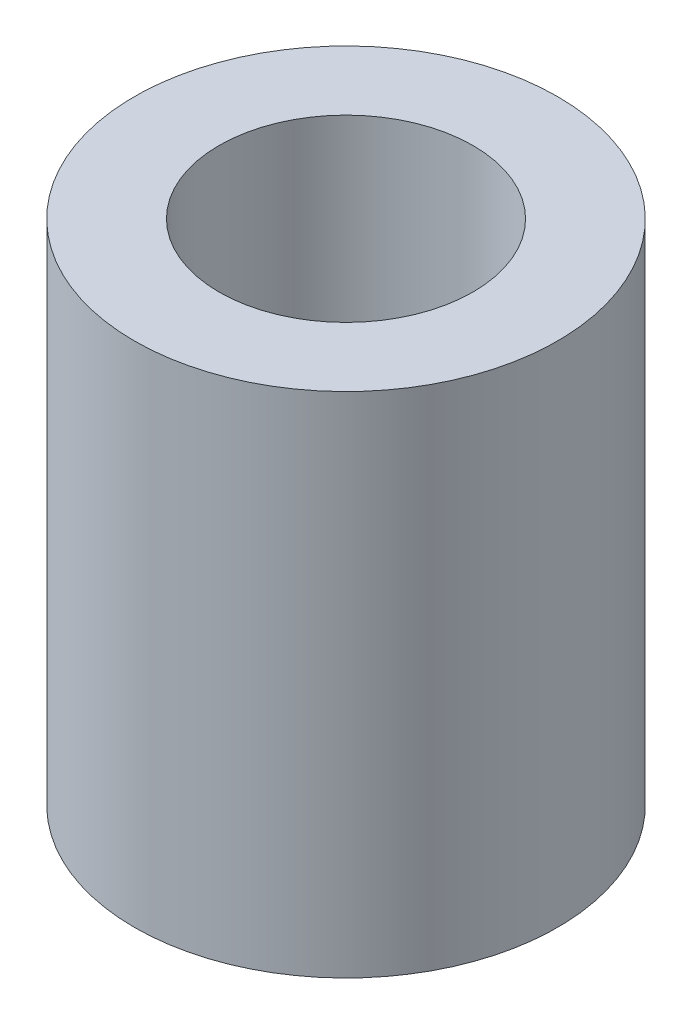
ISO-10303-21;
HEADER;
FILE_DESCRIPTION(('STEP AP214'),'2;1');
FILE_NAME('part.step','',(''),(''),'','','');
FILE_SCHEMA(('AUTOMOTIVE_DESIGN { 1 0 10303 214 1 1 1 1 }'));
ENDSEC;
DATA;
#1=APPLICATION_CONTEXT('core data for automotive mechanical design processes');
#2=APPLICATION_PROTOCOL_DEFINITION('international standard','automotive_design',2000,#1);
#3=PRODUCT_CONTEXT('',#1,'mechanical');
#4=PRODUCT('Part','Part','',(#3));
#5=PRODUCT_RELATED_PRODUCT_CATEGORY('part','',(#4));
#6=PRODUCT_DEFINITION_FORMATION('','',#4);
#7=PRODUCT_DEFINITION_CONTEXT('part definition',#1,'design');
#8=PRODUCT_DEFINITION('design','',#6,#7);
#9=PRODUCT_DEFINITION_SHAPE('','',#8);
#10=(LENGTH_UNIT() NAMED_UNIT(*) SI_UNIT(.MILLI.,.METRE.));
#11=(NAMED_UNIT(*) PLANE_ANGLE_UNIT() SI_UNIT($,.RADIAN.));
#12=(NAMED_UNIT(*) SI_UNIT($,.STERADIAN.) SOLID_ANGLE_UNIT());
#13=UNCERTAINTY_MEASURE_WITH_UNIT(LENGTH_MEASURE(1.E-05),#10,'distance_accuracy_value','');
#14=(GEOMETRIC_REPRESENTATION_CONTEXT(3) GLOBAL_UNCERTAINTY_ASSIGNED_CONTEXT((#13)) GLOBAL_UNIT_ASSIGNED_CONTEXT((#10,
#11,#12)) REPRESENTATION_CONTEXT('',''));
#15=CARTESIAN_POINT('',(0.,0.,0.));
#16=DIRECTION('',(0.,0.,1.));
#17=DIRECTION('',(1.,0.,0.));
#18=AXIS2_PLACEMENT_3D('',#15,#16,#17);
#19=CARTESIAN_POINT('',(0.,38.1,0.));
#20=DIRECTION('',(0.,1.,0.));
#21=DIRECTION('',(0.,0.,1.));
#22=AXIS2_PLACEMENT_3D('',#19,#20,#21);
#23=PLANE('',#22);
#24=CARTESIAN_POINT('',(0.,38.1,0.));
#25=DIRECTION('',(0.,1.,0.));
#26=DIRECTION('',(0.,0.,1.));
#27=AXIS2_PLACEMENT_3D('',#24,#25,#26);
#28=CIRCLE('',#27,15.875);
#29=CARTESIAN_POINT('',(0.,38.1,15.875));
#30=VERTEX_POINT('',#29);
#31=EDGE_CURVE('E10',#30,#30,#28,.T.);
#32=ORIENTED_EDGE('',*,*,#31,.T.);
#33=EDGE_LOOP('',(#32));
#34=FACE_BOUND('',#33,.T.);
#35=CARTESIAN_POINT('',(0.,38.1,0.));
#36=DIRECTION('',(0.,1.,0.));
#37=DIRECTION('',(0.,0.,1.));
#38=AXIS2_PLACEMENT_3D('',#35,#36,#37);
#39=CIRCLE('',#38,9.525);
#40=CARTESIAN_POINT('',(0.,38.1,9.525));
#41=VERTEX_POINT('',#40);
#42=EDGE_CURVE('E44',#41,#41,#39,.T.);
#43=ORIENTED_EDGE('',*,*,#42,.F.);
#44=EDGE_LOOP('',(#43));
#45=FACE_BOUND('',#44,.T.);
#46=ADVANCED_FACE('F33',(#34,#45),#23,.T.);
#47=CARTESIAN_POINT('',(0.,0.,0.));
#48=DIRECTION('',(0.,1.,0.));
#49=DIRECTION('',(0.,0.,1.));
#50=AXIS2_PLACEMENT_3D('',#47,#48,#49);
#51=PLANE('',#50);
#52=CARTESIAN_POINT('',(0.,0.,0.));
#53=DIRECTION('',(0.,1.,0.));
#54=DIRECTION('',(0.,0.,1.));
#55=AXIS2_PLACEMENT_3D('',#52,#53,#54);
#56=CIRCLE('',#55,15.875);
#57=CARTESIAN_POINT('',(0.,0.,15.875));
#58=VERTEX_POINT('',#57);
#59=EDGE_CURVE('E37',#58,#58,#56,.T.);
#60=ORIENTED_EDGE('',*,*,#59,.F.);
#61=EDGE_LOOP('',(#60));
#62=FACE_BOUND('',#61,.T.);
#63=CARTESIAN_POINT('',(0.,0.,0.));
#64=DIRECTION('',(0.,1.,0.));
#65=DIRECTION('',(0.,0.,1.));
#66=AXIS2_PLACEMENT_3D('',#63,#64,#65);
#67=CIRCLE('',#66,9.525);
#68=CARTESIAN_POINT('',(0.,0.,9.525));
#69=VERTEX_POINT('',#68);
#70=EDGE_CURVE('E46',#69,#69,#67,.T.);
#71=ORIENTED_EDGE('',*,*,#70,.T.);
#72=EDGE_LOOP('',(#71));
#73=FACE_BOUND('',#72,.T.);
#74=ADVANCED_FACE('F56',(#62,#73),#51,.F.);
#75=CARTESIAN_POINT('',(0.,38.1,0.));
#76=DIRECTION('',(0.,-1.,0.));
#77=DIRECTION('',(0.,0.,-1.));
#78=AXIS2_PLACEMENT_3D('',#75,#76,#77);
#79=CYLINDRICAL_SURFACE('',#78,15.875);
#80=ORIENTED_EDGE('',*,*,#31,.F.);
#81=EDGE_LOOP('',(#80));
#82=FACE_BOUND('',#81,.T.);
#83=ORIENTED_EDGE('',*,*,#59,.T.);
#84=EDGE_LOOP('',(#83));
#85=FACE_BOUND('',#84,.T.);
#86=ADVANCED_FACE('F35',(#82,#85),#79,.T.);
#87=CARTESIAN_POINT('',(0.,38.1,0.));
#88=DIRECTION('',(0.,-1.,0.));
#89=DIRECTION('',(0.,0.,-1.));
#90=AXIS2_PLACEMENT_3D('',#87,#88,#89);
#91=CYLINDRICAL_SURFACE('',#90,9.525);
#92=ORIENTED_EDGE('',*,*,#42,.T.);
#93=EDGE_LOOP('',(#92));
#94=FACE_BOUND('',#93,.T.);
#95=ORIENTED_EDGE('',*,*,#70,.F.);
#96=EDGE_LOOP('',(#95));
#97=FACE_BOUND('',#96,.T.);
#98=ADVANCED_FACE('F52',(#94,#97),#91,.F.);
#99=CLOSED_SHELL('',(#46,#74,#86,#98));
#100=MANIFOLD_SOLID_BREP('B2',#99);
#101=ADVANCED_BREP_SHAPE_REPRESENTATION('',(#18,#100),#14);
#102=SHAPE_DEFINITION_REPRESENTATION(#9,#101);
ENDSEC;
END-ISO-10303-21;
